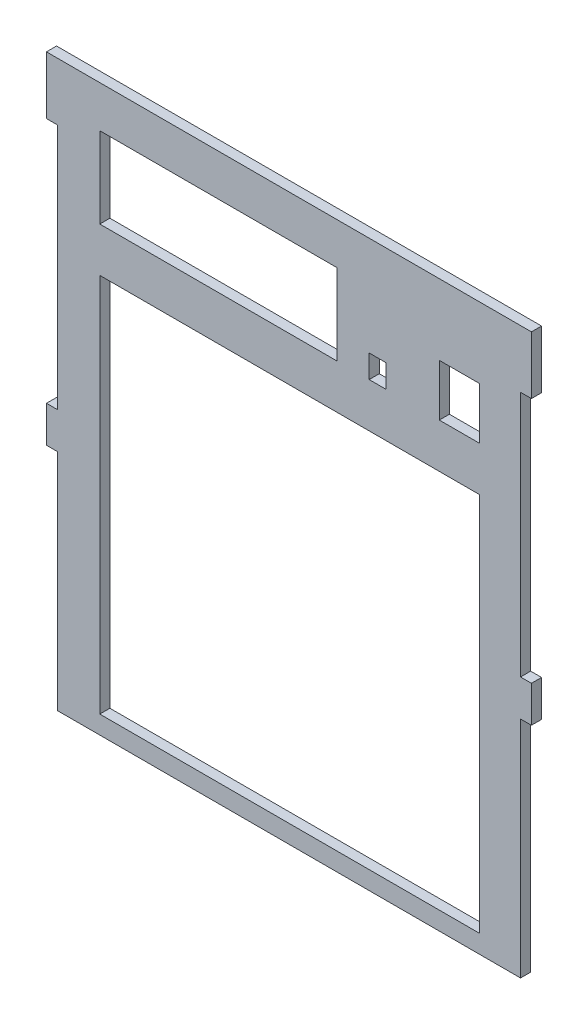
ISO-10303-21;
HEADER;
FILE_DESCRIPTION(('STEP AP214'),'2;1');
FILE_NAME('part.step','',(''),(''),'','','');
FILE_SCHEMA(('AUTOMOTIVE_DESIGN { 1 0 10303 214 1 1 1 1 }'));
ENDSEC;
DATA;
#1=APPLICATION_CONTEXT('core data for automotive mechanical design processes');
#2=APPLICATION_PROTOCOL_DEFINITION('international standard','automotive_design',2000,#1);
#3=PRODUCT_CONTEXT('',#1,'mechanical');
#4=PRODUCT('Part','Part','',(#3));
#5=PRODUCT_RELATED_PRODUCT_CATEGORY('part','',(#4));
#6=PRODUCT_DEFINITION_FORMATION('','',#4);
#7=PRODUCT_DEFINITION_CONTEXT('part definition',#1,'design');
#8=PRODUCT_DEFINITION('design','',#6,#7);
#9=PRODUCT_DEFINITION_SHAPE('','',#8);
#10=(LENGTH_UNIT() NAMED_UNIT(*) SI_UNIT(.MILLI.,.METRE.));
#11=(NAMED_UNIT(*) PLANE_ANGLE_UNIT() SI_UNIT($,.RADIAN.));
#12=(NAMED_UNIT(*) SI_UNIT($,.STERADIAN.) SOLID_ANGLE_UNIT());
#13=UNCERTAINTY_MEASURE_WITH_UNIT(LENGTH_MEASURE(1.E-05),#10,'distance_accuracy_value','');
#14=(GEOMETRIC_REPRESENTATION_CONTEXT(3) GLOBAL_UNCERTAINTY_ASSIGNED_CONTEXT((#13)) GLOBAL_UNIT_ASSIGNED_CONTEXT((#10,
#11,#12)) REPRESENTATION_CONTEXT('',''));
#15=CARTESIAN_POINT('',(0.,0.,0.));
#16=DIRECTION('',(0.,0.,1.));
#17=DIRECTION('',(1.,0.,0.));
#18=AXIS2_PLACEMENT_3D('',#15,#16,#17);
#19=CARTESIAN_POINT('',(3.42899999999999,223.139,0.));
#20=DIRECTION('',(1.,0.,0.));
#21=DIRECTION('',(0.,1.,0.));
#22=AXIS2_PLACEMENT_3D('',#19,#20,#21);
#23=PLANE('',#22);
#24=DIRECTION('',(0.,1.,0.));
#25=VECTOR('',#24,1.);
#26=CARTESIAN_POINT('',(3.42899999999999,223.139,0.));
#27=LINE('',#26,#25);
#28=CARTESIAN_POINT('',(3.42900000000001,145.669,0.));
#29=VERTEX_POINT('',#28);
#30=CARTESIAN_POINT('',(3.42899999999999,223.139,0.));
#31=VERTEX_POINT('',#30);
#32=EDGE_CURVE('E252',#29,#31,#27,.T.);
#33=ORIENTED_EDGE('',*,*,#32,.F.);
#34=DIRECTION('',(0.,0.,1.));
#35=VECTOR('',#34,1.);
#36=CARTESIAN_POINT('',(3.42900000000001,145.669,-11.9332703396849));
#37=LINE('',#36,#35);
#38=CARTESIAN_POINT('',(3.42900000000001,145.669,3.175));
#39=VERTEX_POINT('',#38);
#40=EDGE_CURVE('E262',#29,#39,#37,.T.);
#41=ORIENTED_EDGE('',*,*,#40,.T.);
#42=DIRECTION('',(0.,1.,0.));
#43=VECTOR('',#42,1.);
#44=CARTESIAN_POINT('',(3.42899999999999,223.139,3.175));
#45=LINE('',#44,#43);
#46=CARTESIAN_POINT('',(3.42899999999999,223.139,3.175));
#47=VERTEX_POINT('',#46);
#48=EDGE_CURVE('E497',#39,#47,#45,.T.);
#49=ORIENTED_EDGE('',*,*,#48,.T.);
#50=DIRECTION('',(0.,0.,1.));
#51=VECTOR('',#50,1.);
#52=CARTESIAN_POINT('',(3.42899999999999,223.139,0.));
#53=LINE('',#52,#51);
#54=EDGE_CURVE('E271',#31,#47,#53,.T.);
#55=ORIENTED_EDGE('',*,*,#54,.F.);
#56=EDGE_LOOP('',(#33,#41,#49,#55));
#57=FACE_BOUND('',#56,.T.);
#58=ADVANCED_FACE('F37',(#57),#23,.F.);
#59=CARTESIAN_POINT('',(148.971,223.139,0.));
#60=DIRECTION('',(-1.,0.,0.));
#61=DIRECTION('',(0.,-1.,0.));
#62=AXIS2_PLACEMENT_3D('',#59,#60,#61);
#63=PLANE('',#62);
#64=DIRECTION('',(0.,-1.,0.));
#65=VECTOR('',#64,1.);
#66=CARTESIAN_POINT('',(148.971,223.139,0.));
#67=LINE('',#66,#65);
#68=CARTESIAN_POINT('',(148.971,134.239,0.));
#69=VERTEX_POINT('',#68);
#70=CARTESIAN_POINT('',(148.971,63.754,0.));
#71=VERTEX_POINT('',#70);
#72=EDGE_CURVE('E284',#69,#71,#67,.T.);
#73=ORIENTED_EDGE('',*,*,#72,.F.);
#74=DIRECTION('',(0.,0.,1.));
#75=VECTOR('',#74,1.);
#76=CARTESIAN_POINT('',(148.971,134.239,-11.9332703396849));
#77=LINE('',#76,#75);
#78=CARTESIAN_POINT('',(148.971,134.239,3.175));
#79=VERTEX_POINT('',#78);
#80=EDGE_CURVE('E347',#69,#79,#77,.T.);
#81=ORIENTED_EDGE('',*,*,#80,.T.);
#82=DIRECTION('',(0.,-1.,0.));
#83=VECTOR('',#82,1.);
#84=CARTESIAN_POINT('',(148.971,223.139,3.175));
#85=LINE('',#84,#83);
#86=CARTESIAN_POINT('',(148.971,63.754,3.175));
#87=VERTEX_POINT('',#86);
#88=EDGE_CURVE('E293',#79,#87,#85,.T.);
#89=ORIENTED_EDGE('',*,*,#88,.T.);
#90=DIRECTION('',(0.,0.,-1.));
#91=VECTOR('',#90,1.);
#92=CARTESIAN_POINT('',(148.971,63.754,0.));
#93=LINE('',#92,#91);
#94=EDGE_CURVE('E363',#87,#71,#93,.T.);
#95=ORIENTED_EDGE('',*,*,#94,.T.);
#96=EDGE_LOOP('',(#73,#81,#89,#95));
#97=FACE_BOUND('',#96,.T.);
#98=ADVANCED_FACE('F514',(#97),#63,.F.);
#99=CARTESIAN_POINT('',(0.,0.,3.175));
#100=DIRECTION('',(1.,0.,0.));
#101=DIRECTION('',(0.,0.,-1.));
#102=AXIS2_PLACEMENT_3D('',#99,#100,#101);
#103=PLANE('',#102);
#104=DIRECTION('',(0.,-1.,0.));
#105=VECTOR('',#104,1.);
#106=CARTESIAN_POINT('',(0.,0.,0.));
#107=LINE('',#106,#105);
#108=CARTESIAN_POINT('',(0.,241.3,0.));
#109=VERTEX_POINT('',#108);
#110=CARTESIAN_POINT('',(0.,223.139,0.));
#111=VERTEX_POINT('',#110);
#112=EDGE_CURVE('E299',#109,#111,#107,.T.);
#113=ORIENTED_EDGE('',*,*,#112,.T.);
#114=DIRECTION('',(0.,0.,1.));
#115=VECTOR('',#114,1.);
#116=CARTESIAN_POINT('',(0.,223.139,0.));
#117=LINE('',#116,#115);
#118=CARTESIAN_POINT('',(0.,223.139,3.175));
#119=VERTEX_POINT('',#118);
#120=EDGE_CURVE('E330',#111,#119,#117,.T.);
#121=ORIENTED_EDGE('',*,*,#120,.T.);
#122=DIRECTION('',(0.,-1.,0.));
#123=VECTOR('',#122,1.);
#124=CARTESIAN_POINT('',(0.,0.,3.175));
#125=LINE('',#124,#123);
#126=CARTESIAN_POINT('',(0.,241.3,3.175));
#127=VERTEX_POINT('',#126);
#128=EDGE_CURVE('E301',#127,#119,#125,.T.);
#129=ORIENTED_EDGE('',*,*,#128,.F.);
#130=DIRECTION('',(0.,0.,-1.));
#131=VECTOR('',#130,1.);
#132=CARTESIAN_POINT('',(0.,241.3,3.175));
#133=LINE('',#132,#131);
#134=EDGE_CURVE('E309',#127,#109,#133,.T.);
#135=ORIENTED_EDGE('',*,*,#134,.T.);
#136=EDGE_LOOP('',(#113,#121,#129,#135));
#137=FACE_BOUND('',#136,.T.);
#138=ADVANCED_FACE('F39',(#137),#103,.F.);
#139=CARTESIAN_POINT('',(152.4,0.,3.175));
#140=DIRECTION('',(-1.,0.,0.));
#141=DIRECTION('',(0.,0.,1.));
#142=AXIS2_PLACEMENT_3D('',#139,#140,#141);
#143=PLANE('',#142);
#144=DIRECTION('',(0.,1.,0.));
#145=VECTOR('',#144,1.);
#146=CARTESIAN_POINT('',(152.4,0.,3.175));
#147=LINE('',#146,#145);
#148=CARTESIAN_POINT('',(152.4,223.139,3.175));
#149=VERTEX_POINT('',#148);
#150=CARTESIAN_POINT('',(152.4,241.3,3.175));
#151=VERTEX_POINT('',#150);
#152=EDGE_CURVE('E304',#149,#151,#147,.T.);
#153=ORIENTED_EDGE('',*,*,#152,.F.);
#154=DIRECTION('',(0.,0.,1.));
#155=VECTOR('',#154,1.);
#156=CARTESIAN_POINT('',(152.4,223.139,0.));
#157=LINE('',#156,#155);
#158=CARTESIAN_POINT('',(152.4,223.139,0.));
#159=VERTEX_POINT('',#158);
#160=EDGE_CURVE('E289',#159,#149,#157,.T.);
#161=ORIENTED_EDGE('',*,*,#160,.F.);
#162=DIRECTION('',(0.,1.,0.));
#163=VECTOR('',#162,1.);
#164=CARTESIAN_POINT('',(152.4,0.,0.));
#165=LINE('',#164,#163);
#166=CARTESIAN_POINT('',(152.4,241.3,0.));
#167=VERTEX_POINT('',#166);
#168=EDGE_CURVE('E312',#159,#167,#165,.T.);
#169=ORIENTED_EDGE('',*,*,#168,.T.);
#170=DIRECTION('',(0.,0.,-1.));
#171=VECTOR('',#170,1.);
#172=CARTESIAN_POINT('',(152.4,241.3,3.175));
#173=LINE('',#172,#171);
#174=EDGE_CURVE('E45',#151,#167,#173,.T.);
#175=ORIENTED_EDGE('',*,*,#174,.F.);
#176=EDGE_LOOP('',(#153,#161,#169,#175));
#177=FACE_BOUND('',#176,.T.);
#178=ADVANCED_FACE('F338',(#177),#143,.F.);
#179=CARTESIAN_POINT('',(0.,241.3,3.175));
#180=DIRECTION('',(0.,-1.,0.));
#181=DIRECTION('',(0.,0.,-1.));
#182=AXIS2_PLACEMENT_3D('',#179,#180,#181);
#183=PLANE('',#182);
#184=DIRECTION('',(-1.,0.,0.));
#185=VECTOR('',#184,1.);
#186=CARTESIAN_POINT('',(0.,241.3,0.));
#187=LINE('',#186,#185);
#188=EDGE_CURVE('E305',#167,#109,#187,.T.);
#189=ORIENTED_EDGE('',*,*,#188,.T.);
#190=ORIENTED_EDGE('',*,*,#134,.F.);
#191=DIRECTION('',(-1.,0.,0.));
#192=VECTOR('',#191,1.);
#193=CARTESIAN_POINT('',(0.,241.3,3.175));
#194=LINE('',#193,#192);
#195=EDGE_CURVE('E307',#151,#127,#194,.T.);
#196=ORIENTED_EDGE('',*,*,#195,.F.);
#197=ORIENTED_EDGE('',*,*,#174,.T.);
#198=EDGE_LOOP('',(#189,#190,#196,#197));
#199=FACE_BOUND('',#198,.T.);
#200=ADVANCED_FACE('F321',(#199),#183,.F.);
#201=CARTESIAN_POINT('',(0.,0.,3.175));
#202=DIRECTION('',(0.,0.,-1.));
#203=DIRECTION('',(-1.,0.,0.));
#204=AXIS2_PLACEMENT_3D('',#201,#202,#203);
#205=PLANE('',#204);
#206=DIRECTION('',(1.,0.,0.));
#207=VECTOR('',#206,1.);
#208=CARTESIAN_POINT('',(16.764,69.469,3.175));
#209=LINE('',#208,#207);
#210=CARTESIAN_POINT('',(16.764,69.469,3.175));
#211=VERTEX_POINT('',#210);
#212=CARTESIAN_POINT('',(136.144,69.469,3.175));
#213=VERTEX_POINT('',#212);
#214=EDGE_CURVE('E480',#211,#213,#209,.T.);
#215=ORIENTED_EDGE('',*,*,#214,.F.);
#216=DIRECTION('',(0.,-1.,0.));
#217=VECTOR('',#216,1.);
#218=CARTESIAN_POINT('',(16.764,188.849,3.175));
#219=LINE('',#218,#217);
#220=CARTESIAN_POINT('',(16.764,188.849,3.175));
#221=VERTEX_POINT('',#220);
#222=EDGE_CURVE('E483',#221,#211,#219,.T.);
#223=ORIENTED_EDGE('',*,*,#222,.F.);
#224=DIRECTION('',(-1.,0.,0.));
#225=VECTOR('',#224,1.);
#226=CARTESIAN_POINT('',(16.764,188.849,3.175));
#227=LINE('',#226,#225);
#228=CARTESIAN_POINT('',(136.144,188.849,3.175));
#229=VERTEX_POINT('',#228);
#230=EDGE_CURVE('E473',#229,#221,#227,.T.);
#231=ORIENTED_EDGE('',*,*,#230,.F.);
#232=DIRECTION('',(0.,1.,0.));
#233=VECTOR('',#232,1.);
#234=CARTESIAN_POINT('',(136.144,188.849,3.175));
#235=LINE('',#234,#233);
#236=EDGE_CURVE('E476',#213,#229,#235,.T.);
#237=ORIENTED_EDGE('',*,*,#236,.F.);
#238=EDGE_LOOP('',(#215,#223,#231,#237));
#239=FACE_BOUND('',#238,.T.);
#240=DIRECTION('',(1.,0.,0.));
#241=VECTOR('',#240,1.);
#242=CARTESIAN_POINT('',(16.764,202.819,3.175));
#243=LINE('',#242,#241);
#244=CARTESIAN_POINT('',(16.764,202.819,3.175));
#245=VERTEX_POINT('',#244);
#246=CARTESIAN_POINT('',(91.3765,202.819,3.175));
#247=VERTEX_POINT('',#246);
#248=EDGE_CURVE('E448',#245,#247,#243,.T.);
#249=ORIENTED_EDGE('',*,*,#248,.F.);
#250=DIRECTION('',(0.,-1.,0.));
#251=VECTOR('',#250,1.);
#252=CARTESIAN_POINT('',(16.764,228.219,3.175));
#253=LINE('',#252,#251);
#254=CARTESIAN_POINT('',(16.764,228.219,3.175));
#255=VERTEX_POINT('',#254);
#256=EDGE_CURVE('E451',#255,#245,#253,.T.);
#257=ORIENTED_EDGE('',*,*,#256,.F.);
#258=DIRECTION('',(-1.,0.,0.));
#259=VECTOR('',#258,1.);
#260=CARTESIAN_POINT('',(16.764,228.219,3.175));
#261=LINE('',#260,#259);
#262=CARTESIAN_POINT('',(91.3765,228.219,3.175));
#263=VERTEX_POINT('',#262);
#264=EDGE_CURVE('E441',#263,#255,#261,.T.);
#265=ORIENTED_EDGE('',*,*,#264,.F.);
#266=DIRECTION('',(0.,1.,0.));
#267=VECTOR('',#266,1.);
#268=CARTESIAN_POINT('',(91.3765,228.219,3.175));
#269=LINE('',#268,#267);
#270=EDGE_CURVE('E444',#247,#263,#269,.T.);
#271=ORIENTED_EDGE('',*,*,#270,.F.);
#272=EDGE_LOOP('',(#249,#257,#265,#271));
#273=FACE_BOUND('',#272,.T.);
#274=DIRECTION('',(1.,0.,0.));
#275=VECTOR('',#274,1.);
#276=CARTESIAN_POINT('',(123.444,202.819,3.175));
#277=LINE('',#276,#275);
#278=CARTESIAN_POINT('',(123.444,202.819,3.175));
#279=VERTEX_POINT('',#278);
#280=CARTESIAN_POINT('',(136.144,202.819,3.175));
#281=VERTEX_POINT('',#280);
#282=EDGE_CURVE('E416',#279,#281,#277,.T.);
#283=ORIENTED_EDGE('',*,*,#282,.F.);
#284=DIRECTION('',(0.,-1.,0.));
#285=VECTOR('',#284,1.);
#286=CARTESIAN_POINT('',(123.444,219.075,3.175));
#287=LINE('',#286,#285);
#288=CARTESIAN_POINT('',(123.444,219.075,3.175));
#289=VERTEX_POINT('',#288);
#290=EDGE_CURVE('E419',#289,#279,#287,.T.);
#291=ORIENTED_EDGE('',*,*,#290,.F.);
#292=DIRECTION('',(-1.,0.,0.));
#293=VECTOR('',#292,1.);
#294=CARTESIAN_POINT('',(123.444,219.075,3.175));
#295=LINE('',#294,#293);
#296=CARTESIAN_POINT('',(136.144,219.075,3.175));
#297=VERTEX_POINT('',#296);
#298=EDGE_CURVE('E409',#297,#289,#295,.T.);
#299=ORIENTED_EDGE('',*,*,#298,.F.);
#300=DIRECTION('',(0.,1.,0.));
#301=VECTOR('',#300,1.);
#302=CARTESIAN_POINT('',(136.144,219.075,3.175));
#303=LINE('',#302,#301);
#304=EDGE_CURVE('E412',#281,#297,#303,.T.);
#305=ORIENTED_EDGE('',*,*,#304,.F.);
#306=EDGE_LOOP('',(#283,#291,#299,#305));
#307=FACE_BOUND('',#306,.T.);
#308=DIRECTION('',(1.,0.,0.));
#309=VECTOR('',#308,1.);
#310=CARTESIAN_POINT('',(101.4095,202.819,3.175));
#311=LINE('',#310,#309);
#312=CARTESIAN_POINT('',(101.4095,202.819,3.175));
#313=VERTEX_POINT('',#312);
#314=CARTESIAN_POINT('',(106.7435,202.819,3.175));
#315=VERTEX_POINT('',#314);
#316=EDGE_CURVE('E384',#313,#315,#311,.T.);
#317=ORIENTED_EDGE('',*,*,#316,.F.);
#318=DIRECTION('',(0.,-1.,0.));
#319=VECTOR('',#318,1.);
#320=CARTESIAN_POINT('',(101.4095,210.058,3.175));
#321=LINE('',#320,#319);
#322=CARTESIAN_POINT('',(101.4095,210.058,3.175));
#323=VERTEX_POINT('',#322);
#324=EDGE_CURVE('E387',#323,#313,#321,.T.);
#325=ORIENTED_EDGE('',*,*,#324,.F.);
#326=DIRECTION('',(-1.,0.,0.));
#327=VECTOR('',#326,1.);
#328=CARTESIAN_POINT('',(101.4095,210.058,3.175));
#329=LINE('',#328,#327);
#330=CARTESIAN_POINT('',(106.7435,210.058,3.175));
#331=VERTEX_POINT('',#330);
#332=EDGE_CURVE('E377',#331,#323,#329,.T.);
#333=ORIENTED_EDGE('',*,*,#332,.F.);
#334=DIRECTION('',(0.,1.,0.));
#335=VECTOR('',#334,1.);
#336=CARTESIAN_POINT('',(106.7435,210.058,3.175));
#337=LINE('',#336,#335);
#338=EDGE_CURVE('E380',#315,#331,#337,.T.);
#339=ORIENTED_EDGE('',*,*,#338,.F.);
#340=EDGE_LOOP('',(#317,#325,#333,#339));
#341=FACE_BOUND('',#340,.T.);
#342=CARTESIAN_POINT('',(3.42900000000001,63.7540000000001,3.175));
#343=VERTEX_POINT('',#342);
#344=CARTESIAN_POINT('',(3.42900000000001,134.239,3.175));
#345=VERTEX_POINT('',#344);
#346=EDGE_CURVE('E294',#343,#345,#45,.T.);
#347=ORIENTED_EDGE('',*,*,#346,.F.);
#348=DIRECTION('',(-1.,0.,0.));
#349=VECTOR('',#348,1.);
#350=CARTESIAN_POINT('',(169.390878768756,63.754,3.175));
#351=LINE('',#350,#349);
#352=EDGE_CURVE('E350',#87,#343,#351,.T.);
#353=ORIENTED_EDGE('',*,*,#352,.F.);
#354=ORIENTED_EDGE('',*,*,#88,.F.);
#355=DIRECTION('',(1.,0.,0.));
#356=VECTOR('',#355,1.);
#357=CARTESIAN_POINT('',(148.971,134.239,3.175));
#358=LINE('',#357,#356);
#359=CARTESIAN_POINT('',(152.4,134.239,3.175));
#360=VERTEX_POINT('',#359);
#361=EDGE_CURVE('E945',#79,#360,#358,.T.);
#362=ORIENTED_EDGE('',*,*,#361,.T.);
#363=DIRECTION('',(0.,1.,0.));
#364=VECTOR('',#363,1.);
#365=CARTESIAN_POINT('',(152.4,145.669,3.175));
#366=LINE('',#365,#364);
#367=CARTESIAN_POINT('',(152.4,145.669,3.175));
#368=VERTEX_POINT('',#367);
#369=EDGE_CURVE('E951',#360,#368,#366,.T.);
#370=ORIENTED_EDGE('',*,*,#369,.T.);
#371=DIRECTION('',(-1.,0.,0.));
#372=VECTOR('',#371,1.);
#373=CARTESIAN_POINT('',(148.971,145.669,3.175));
#374=LINE('',#373,#372);
#375=CARTESIAN_POINT('',(148.971,145.669,3.175));
#376=VERTEX_POINT('',#375);
#377=EDGE_CURVE('E949',#368,#376,#374,.T.);
#378=ORIENTED_EDGE('',*,*,#377,.T.);
#379=CARTESIAN_POINT('',(148.971,223.139,3.175));
#380=VERTEX_POINT('',#379);
#381=EDGE_CURVE('E285',#380,#376,#85,.T.);
#382=ORIENTED_EDGE('',*,*,#381,.F.);
#383=DIRECTION('',(-1.,0.,0.));
#384=VECTOR('',#383,1.);
#385=CARTESIAN_POINT('',(152.4,223.139,3.175));
#386=LINE('',#385,#384);
#387=EDGE_CURVE('E290',#149,#380,#386,.T.);
#388=ORIENTED_EDGE('',*,*,#387,.F.);
#389=ORIENTED_EDGE('',*,*,#152,.T.);
#390=ORIENTED_EDGE('',*,*,#195,.T.);
#391=ORIENTED_EDGE('',*,*,#128,.T.);
#392=DIRECTION('',(-1.,0.,0.));
#393=VECTOR('',#392,1.);
#394=CARTESIAN_POINT('',(0.,223.139,3.175));
#395=LINE('',#394,#393);
#396=EDGE_CURVE('E277',#47,#119,#395,.T.);
#397=ORIENTED_EDGE('',*,*,#396,.F.);
#398=ORIENTED_EDGE('',*,*,#48,.F.);
#399=DIRECTION('',(-1.,0.,0.));
#400=VECTOR('',#399,1.);
#401=CARTESIAN_POINT('',(3.42900000000001,145.669,3.175));
#402=LINE('',#401,#400);
#403=CARTESIAN_POINT('',(0.,145.669,3.175));
#404=VERTEX_POINT('',#403);
#405=EDGE_CURVE('E265',#39,#404,#402,.T.);
#406=ORIENTED_EDGE('',*,*,#405,.T.);
#407=DIRECTION('',(0.,-1.,0.));
#408=VECTOR('',#407,1.);
#409=CARTESIAN_POINT('',(0.,145.669,3.175));
#410=LINE('',#409,#408);
#411=CARTESIAN_POINT('',(0.,134.239,3.175));
#412=VERTEX_POINT('',#411);
#413=EDGE_CURVE('E936',#404,#412,#410,.T.);
#414=ORIENTED_EDGE('',*,*,#413,.T.);
#415=DIRECTION('',(1.,0.,0.));
#416=VECTOR('',#415,1.);
#417=CARTESIAN_POINT('',(3.42900000000001,134.239,3.175));
#418=LINE('',#417,#416);
#419=EDGE_CURVE('E258',#412,#345,#418,.T.);
#420=ORIENTED_EDGE('',*,*,#419,.T.);
#421=EDGE_LOOP('',(#347,#353,#354,#362,#370,#378,#382,#388,#389,#390,#391,#397,#398,#406,#414,#420));
#422=FACE_BOUND('',#421,.T.);
#423=ADVANCED_FACE('F334',(#239,#273,#307,#341,#422),#205,.F.);
#424=CARTESIAN_POINT('',(0.,0.,0.));
#425=DIRECTION('',(0.,0.,-1.));
#426=DIRECTION('',(-1.,0.,0.));
#427=AXIS2_PLACEMENT_3D('',#424,#425,#426);
#428=PLANE('',#427);
#429=DIRECTION('',(-1.,0.,0.));
#430=VECTOR('',#429,1.);
#431=CARTESIAN_POINT('',(169.390878768756,63.754,0.));
#432=LINE('',#431,#430);
#433=CARTESIAN_POINT('',(3.42900000000002,63.754,0.));
#434=VERTEX_POINT('',#433);
#435=EDGE_CURVE('E361',#71,#434,#432,.T.);
#436=ORIENTED_EDGE('',*,*,#435,.T.);
#437=CARTESIAN_POINT('',(3.429,134.239,0.));
#438=VERTEX_POINT('',#437);
#439=EDGE_CURVE('E273',#434,#438,#27,.T.);
#440=ORIENTED_EDGE('',*,*,#439,.T.);
#441=DIRECTION('',(1.,0.,0.));
#442=VECTOR('',#441,1.);
#443=CARTESIAN_POINT('',(3.42900000000001,134.239,0.));
#444=LINE('',#443,#442);
#445=CARTESIAN_POINT('',(0.,134.239,0.));
#446=VERTEX_POINT('',#445);
#447=EDGE_CURVE('E52',#446,#438,#444,.T.);
#448=ORIENTED_EDGE('',*,*,#447,.F.);
#449=DIRECTION('',(0.,-1.,0.));
#450=VECTOR('',#449,1.);
#451=CARTESIAN_POINT('',(0.,145.669,0.));
#452=LINE('',#451,#450);
#453=CARTESIAN_POINT('',(0.,145.669,0.));
#454=VERTEX_POINT('',#453);
#455=EDGE_CURVE('E255',#454,#446,#452,.T.);
#456=ORIENTED_EDGE('',*,*,#455,.F.);
#457=DIRECTION('',(-1.,0.,0.));
#458=VECTOR('',#457,1.);
#459=CARTESIAN_POINT('',(3.42900000000001,145.669,0.));
#460=LINE('',#459,#458);
#461=EDGE_CURVE('E245',#29,#454,#460,.T.);
#462=ORIENTED_EDGE('',*,*,#461,.F.);
#463=ORIENTED_EDGE('',*,*,#32,.T.);
#464=DIRECTION('',(-1.,0.,0.));
#465=VECTOR('',#464,1.);
#466=CARTESIAN_POINT('',(0.,223.139,0.));
#467=LINE('',#466,#465);
#468=EDGE_CURVE('E274',#31,#111,#467,.T.);
#469=ORIENTED_EDGE('',*,*,#468,.T.);
#470=ORIENTED_EDGE('',*,*,#112,.F.);
#471=ORIENTED_EDGE('',*,*,#188,.F.);
#472=ORIENTED_EDGE('',*,*,#168,.F.);
#473=DIRECTION('',(-1.,0.,0.));
#474=VECTOR('',#473,1.);
#475=CARTESIAN_POINT('',(152.4,223.139,0.));
#476=LINE('',#475,#474);
#477=CARTESIAN_POINT('',(148.971,223.139,0.));
#478=VERTEX_POINT('',#477);
#479=EDGE_CURVE('E281',#159,#478,#476,.T.);
#480=ORIENTED_EDGE('',*,*,#479,.T.);
#481=CARTESIAN_POINT('',(148.971,145.669,0.));
#482=VERTEX_POINT('',#481);
#483=EDGE_CURVE('E286',#478,#482,#67,.T.);
#484=ORIENTED_EDGE('',*,*,#483,.T.);
#485=DIRECTION('',(-1.,0.,0.));
#486=VECTOR('',#485,1.);
#487=CARTESIAN_POINT('',(148.971,145.669,0.));
#488=LINE('',#487,#486);
#489=CARTESIAN_POINT('',(152.4,145.669,0.));
#490=VERTEX_POINT('',#489);
#491=EDGE_CURVE('E60',#490,#482,#488,.T.);
#492=ORIENTED_EDGE('',*,*,#491,.F.);
#493=DIRECTION('',(0.,1.,0.));
#494=VECTOR('',#493,1.);
#495=CARTESIAN_POINT('',(152.4,145.669,0.));
#496=LINE('',#495,#494);
#497=CARTESIAN_POINT('',(152.4,134.239,0.));
#498=VERTEX_POINT('',#497);
#499=EDGE_CURVE('E356',#498,#490,#496,.T.);
#500=ORIENTED_EDGE('',*,*,#499,.F.);
#501=DIRECTION('',(1.,0.,0.));
#502=VECTOR('',#501,1.);
#503=CARTESIAN_POINT('',(148.971,134.239,0.));
#504=LINE('',#503,#502);
#505=EDGE_CURVE('E359',#69,#498,#504,.T.);
#506=ORIENTED_EDGE('',*,*,#505,.F.);
#507=ORIENTED_EDGE('',*,*,#72,.T.);
#508=EDGE_LOOP('',(#436,#440,#448,#456,#462,#463,#469,#470,#471,#472,#480,#484,#492,#500,#506,#507));
#509=FACE_BOUND('',#508,.T.);
#510=DIRECTION('',(0.,-1.,0.));
#511=VECTOR('',#510,1.);
#512=CARTESIAN_POINT('',(16.764,188.849,0.));
#513=LINE('',#512,#511);
#514=CARTESIAN_POINT('',(16.764,188.849,0.));
#515=VERTEX_POINT('',#514);
#516=CARTESIAN_POINT('',(16.764,69.469,0.));
#517=VERTEX_POINT('',#516);
#518=EDGE_CURVE('E477',#515,#517,#513,.T.);
#519=ORIENTED_EDGE('',*,*,#518,.T.);
#520=DIRECTION('',(1.,0.,0.));
#521=VECTOR('',#520,1.);
#522=CARTESIAN_POINT('',(16.764,69.469,0.));
#523=LINE('',#522,#521);
#524=CARTESIAN_POINT('',(136.144,69.469,0.));
#525=VERTEX_POINT('',#524);
#526=EDGE_CURVE('E490',#517,#525,#523,.T.);
#527=ORIENTED_EDGE('',*,*,#526,.T.);
#528=DIRECTION('',(0.,1.,0.));
#529=VECTOR('',#528,1.);
#530=CARTESIAN_POINT('',(136.144,188.849,0.));
#531=LINE('',#530,#529);
#532=CARTESIAN_POINT('',(136.144,188.849,0.));
#533=VERTEX_POINT('',#532);
#534=EDGE_CURVE('E487',#525,#533,#531,.T.);
#535=ORIENTED_EDGE('',*,*,#534,.T.);
#536=DIRECTION('',(-1.,0.,0.));
#537=VECTOR('',#536,1.);
#538=CARTESIAN_POINT('',(16.764,188.849,0.));
#539=LINE('',#538,#537);
#540=EDGE_CURVE('E467',#533,#515,#539,.T.);
#541=ORIENTED_EDGE('',*,*,#540,.T.);
#542=EDGE_LOOP('',(#519,#527,#535,#541));
#543=FACE_BOUND('',#542,.T.);
#544=DIRECTION('',(0.,-1.,0.));
#545=VECTOR('',#544,1.);
#546=CARTESIAN_POINT('',(16.764,228.219,0.));
#547=LINE('',#546,#545);
#548=CARTESIAN_POINT('',(16.764,228.219,0.));
#549=VERTEX_POINT('',#548);
#550=CARTESIAN_POINT('',(16.764,202.819,0.));
#551=VERTEX_POINT('',#550);
#552=EDGE_CURVE('E445',#549,#551,#547,.T.);
#553=ORIENTED_EDGE('',*,*,#552,.T.);
#554=DIRECTION('',(1.,0.,0.));
#555=VECTOR('',#554,1.);
#556=CARTESIAN_POINT('',(16.764,202.819,0.));
#557=LINE('',#556,#555);
#558=CARTESIAN_POINT('',(91.3765,202.819,0.));
#559=VERTEX_POINT('',#558);
#560=EDGE_CURVE('E459',#551,#559,#557,.T.);
#561=ORIENTED_EDGE('',*,*,#560,.T.);
#562=DIRECTION('',(0.,1.,0.));
#563=VECTOR('',#562,1.);
#564=CARTESIAN_POINT('',(91.3765,228.219,0.));
#565=LINE('',#564,#563);
#566=CARTESIAN_POINT('',(91.3765,228.219,0.));
#567=VERTEX_POINT('',#566);
#568=EDGE_CURVE('E456',#559,#567,#565,.T.);
#569=ORIENTED_EDGE('',*,*,#568,.T.);
#570=DIRECTION('',(-1.,0.,0.));
#571=VECTOR('',#570,1.);
#572=CARTESIAN_POINT('',(16.764,228.219,0.));
#573=LINE('',#572,#571);
#574=EDGE_CURVE('E435',#567,#549,#573,.T.);
#575=ORIENTED_EDGE('',*,*,#574,.T.);
#576=EDGE_LOOP('',(#553,#561,#569,#575));
#577=FACE_BOUND('',#576,.T.);
#578=DIRECTION('',(0.,-1.,0.));
#579=VECTOR('',#578,1.);
#580=CARTESIAN_POINT('',(123.444,219.075,0.));
#581=LINE('',#580,#579);
#582=CARTESIAN_POINT('',(123.444,219.075,0.));
#583=VERTEX_POINT('',#582);
#584=CARTESIAN_POINT('',(123.444,202.819,0.));
#585=VERTEX_POINT('',#584);
#586=EDGE_CURVE('E413',#583,#585,#581,.T.);
#587=ORIENTED_EDGE('',*,*,#586,.T.);
#588=DIRECTION('',(1.,0.,0.));
#589=VECTOR('',#588,1.);
#590=CARTESIAN_POINT('',(123.444,202.819,0.));
#591=LINE('',#590,#589);
#592=CARTESIAN_POINT('',(136.144,202.819,0.));
#593=VERTEX_POINT('',#592);
#594=EDGE_CURVE('E427',#585,#593,#591,.T.);
#595=ORIENTED_EDGE('',*,*,#594,.T.);
#596=DIRECTION('',(0.,1.,0.));
#597=VECTOR('',#596,1.);
#598=CARTESIAN_POINT('',(136.144,219.075,0.));
#599=LINE('',#598,#597);
#600=CARTESIAN_POINT('',(136.144,219.075,0.));
#601=VERTEX_POINT('',#600);
#602=EDGE_CURVE('E424',#593,#601,#599,.T.);
#603=ORIENTED_EDGE('',*,*,#602,.T.);
#604=DIRECTION('',(-1.,0.,0.));
#605=VECTOR('',#604,1.);
#606=CARTESIAN_POINT('',(123.444,219.075,0.));
#607=LINE('',#606,#605);
#608=EDGE_CURVE('E403',#601,#583,#607,.T.);
#609=ORIENTED_EDGE('',*,*,#608,.T.);
#610=EDGE_LOOP('',(#587,#595,#603,#609));
#611=FACE_BOUND('',#610,.T.);
#612=DIRECTION('',(0.,-1.,0.));
#613=VECTOR('',#612,1.);
#614=CARTESIAN_POINT('',(101.4095,210.058,0.));
#615=LINE('',#614,#613);
#616=CARTESIAN_POINT('',(101.4095,210.058,0.));
#617=VERTEX_POINT('',#616);
#618=CARTESIAN_POINT('',(101.4095,202.819,0.));
#619=VERTEX_POINT('',#618);
#620=EDGE_CURVE('E381',#617,#619,#615,.T.);
#621=ORIENTED_EDGE('',*,*,#620,.T.);
#622=DIRECTION('',(1.,0.,0.));
#623=VECTOR('',#622,1.);
#624=CARTESIAN_POINT('',(101.4095,202.819,0.));
#625=LINE('',#624,#623);
#626=CARTESIAN_POINT('',(106.7435,202.819,0.));
#627=VERTEX_POINT('',#626);
#628=EDGE_CURVE('E395',#619,#627,#625,.T.);
#629=ORIENTED_EDGE('',*,*,#628,.T.);
#630=DIRECTION('',(0.,1.,0.));
#631=VECTOR('',#630,1.);
#632=CARTESIAN_POINT('',(106.7435,210.058,0.));
#633=LINE('',#632,#631);
#634=CARTESIAN_POINT('',(106.7435,210.058,0.));
#635=VERTEX_POINT('',#634);
#636=EDGE_CURVE('E392',#627,#635,#633,.T.);
#637=ORIENTED_EDGE('',*,*,#636,.T.);
#638=DIRECTION('',(-1.,0.,0.));
#639=VECTOR('',#638,1.);
#640=CARTESIAN_POINT('',(101.4095,210.058,0.));
#641=LINE('',#640,#639);
#642=EDGE_CURVE('E371',#635,#617,#641,.T.);
#643=ORIENTED_EDGE('',*,*,#642,.T.);
#644=EDGE_LOOP('',(#621,#629,#637,#643));
#645=FACE_BOUND('',#644,.T.);
#646=ADVANCED_FACE('F248',(#509,#543,#577,#611,#645),#428,.T.);
#647=ORIENTED_EDGE('',*,*,#381,.T.);
#648=DIRECTION('',(0.,0.,1.));
#649=VECTOR('',#648,1.);
#650=CARTESIAN_POINT('',(148.971,145.669,-11.9332703396849));
#651=LINE('',#650,#649);
#652=EDGE_CURVE('E344',#482,#376,#651,.T.);
#653=ORIENTED_EDGE('',*,*,#652,.F.);
#654=ORIENTED_EDGE('',*,*,#483,.F.);
#655=DIRECTION('',(0.,0.,1.));
#656=VECTOR('',#655,1.);
#657=CARTESIAN_POINT('',(148.971,223.139,0.));
#658=LINE('',#657,#656);
#659=EDGE_CURVE('E297',#478,#380,#658,.T.);
#660=ORIENTED_EDGE('',*,*,#659,.T.);
#661=EDGE_LOOP('',(#647,#653,#654,#660));
#662=FACE_BOUND('',#661,.T.);
#663=ADVANCED_FACE('F343',(#662),#63,.F.);
#664=CARTESIAN_POINT('',(152.4,223.139,0.));
#665=DIRECTION('',(0.,1.,0.));
#666=DIRECTION('',(0.,0.,1.));
#667=AXIS2_PLACEMENT_3D('',#664,#665,#666);
#668=PLANE('',#667);
#669=ORIENTED_EDGE('',*,*,#387,.T.);
#670=ORIENTED_EDGE('',*,*,#659,.F.);
#671=ORIENTED_EDGE('',*,*,#479,.F.);
#672=ORIENTED_EDGE('',*,*,#160,.T.);
#673=EDGE_LOOP('',(#669,#670,#671,#672));
#674=FACE_BOUND('',#673,.T.);
#675=ADVANCED_FACE('F340',(#674),#668,.F.);
#676=CARTESIAN_POINT('',(0.,223.139,0.));
#677=DIRECTION('',(0.,1.,0.));
#678=DIRECTION('',(0.,0.,1.));
#679=AXIS2_PLACEMENT_3D('',#676,#677,#678);
#680=PLANE('',#679);
#681=ORIENTED_EDGE('',*,*,#396,.T.);
#682=ORIENTED_EDGE('',*,*,#120,.F.);
#683=ORIENTED_EDGE('',*,*,#468,.F.);
#684=ORIENTED_EDGE('',*,*,#54,.T.);
#685=EDGE_LOOP('',(#681,#682,#683,#684));
#686=FACE_BOUND('',#685,.T.);
#687=ADVANCED_FACE('F501',(#686),#680,.F.);
#688=ORIENTED_EDGE('',*,*,#346,.T.);
#689=DIRECTION('',(0.,0.,1.));
#690=VECTOR('',#689,1.);
#691=CARTESIAN_POINT('',(3.42900000000001,134.239,-11.9332703396849));
#692=LINE('',#691,#690);
#693=EDGE_CURVE('E268',#438,#345,#692,.T.);
#694=ORIENTED_EDGE('',*,*,#693,.F.);
#695=ORIENTED_EDGE('',*,*,#439,.F.);
#696=DIRECTION('',(0.,0.,1.));
#697=VECTOR('',#696,1.);
#698=CARTESIAN_POINT('',(3.42900000000001,63.7539999999999,0.));
#699=LINE('',#698,#697);
#700=EDGE_CURVE('E11',#434,#343,#699,.T.);
#701=ORIENTED_EDGE('',*,*,#700,.T.);
#702=EDGE_LOOP('',(#688,#694,#695,#701));
#703=FACE_BOUND('',#702,.T.);
#704=ADVANCED_FACE('F503',(#703),#23,.F.);
#705=CARTESIAN_POINT('',(101.4095,210.058,0.));
#706=DIRECTION('',(-1.,0.,0.));
#707=DIRECTION('',(0.,-1.,0.));
#708=AXIS2_PLACEMENT_3D('',#705,#706,#707);
#709=PLANE('',#708);
#710=ORIENTED_EDGE('',*,*,#324,.T.);
#711=DIRECTION('',(0.,0.,1.));
#712=VECTOR('',#711,1.);
#713=CARTESIAN_POINT('',(101.4095,202.819,0.));
#714=LINE('',#713,#712);
#715=EDGE_CURVE('E368',#619,#313,#714,.T.);
#716=ORIENTED_EDGE('',*,*,#715,.F.);
#717=ORIENTED_EDGE('',*,*,#620,.F.);
#718=DIRECTION('',(0.,0.,1.));
#719=VECTOR('',#718,1.);
#720=CARTESIAN_POINT('',(101.4095,210.058,0.));
#721=LINE('',#720,#719);
#722=EDGE_CURVE('E367',#617,#323,#721,.T.);
#723=ORIENTED_EDGE('',*,*,#722,.T.);
#724=EDGE_LOOP('',(#710,#716,#717,#723));
#725=FACE_BOUND('',#724,.T.);
#726=ADVANCED_FACE('F509',(#725),#709,.F.);
#727=CARTESIAN_POINT('',(101.4095,210.058,0.));
#728=DIRECTION('',(0.,1.,0.));
#729=DIRECTION('',(-1.,0.,0.));
#730=AXIS2_PLACEMENT_3D('',#727,#728,#729);
#731=PLANE('',#730);
#732=ORIENTED_EDGE('',*,*,#332,.T.);
#733=ORIENTED_EDGE('',*,*,#722,.F.);
#734=ORIENTED_EDGE('',*,*,#642,.F.);
#735=DIRECTION('',(0.,0.,1.));
#736=VECTOR('',#735,1.);
#737=CARTESIAN_POINT('',(106.7435,210.058,0.));
#738=LINE('',#737,#736);
#739=EDGE_CURVE('E374',#635,#331,#738,.T.);
#740=ORIENTED_EDGE('',*,*,#739,.T.);
#741=EDGE_LOOP('',(#732,#733,#734,#740));
#742=FACE_BOUND('',#741,.T.);
#743=ADVANCED_FACE('F570',(#742),#731,.F.);
#744=CARTESIAN_POINT('',(106.7435,210.058,0.));
#745=DIRECTION('',(1.,0.,0.));
#746=DIRECTION('',(0.,0.,-1.));
#747=AXIS2_PLACEMENT_3D('',#744,#745,#746);
#748=PLANE('',#747);
#749=ORIENTED_EDGE('',*,*,#338,.T.);
#750=ORIENTED_EDGE('',*,*,#739,.F.);
#751=ORIENTED_EDGE('',*,*,#636,.F.);
#752=DIRECTION('',(0.,0.,1.));
#753=VECTOR('',#752,1.);
#754=CARTESIAN_POINT('',(106.7435,202.819,0.));
#755=LINE('',#754,#753);
#756=EDGE_CURVE('E372',#627,#315,#755,.T.);
#757=ORIENTED_EDGE('',*,*,#756,.T.);
#758=EDGE_LOOP('',(#749,#750,#751,#757));
#759=FACE_BOUND('',#758,.T.);
#760=ADVANCED_FACE('F573',(#759),#748,.F.);
#761=CARTESIAN_POINT('',(101.4095,202.819,0.));
#762=DIRECTION('',(0.,-1.,0.));
#763=DIRECTION('',(0.,0.,-1.));
#764=AXIS2_PLACEMENT_3D('',#761,#762,#763);
#765=PLANE('',#764);
#766=ORIENTED_EDGE('',*,*,#316,.T.);
#767=ORIENTED_EDGE('',*,*,#756,.F.);
#768=ORIENTED_EDGE('',*,*,#628,.F.);
#769=ORIENTED_EDGE('',*,*,#715,.T.);
#770=EDGE_LOOP('',(#766,#767,#768,#769));
#771=FACE_BOUND('',#770,.T.);
#772=ADVANCED_FACE('F568',(#771),#765,.F.);
#773=CARTESIAN_POINT('',(123.444,219.075,0.));
#774=DIRECTION('',(-1.,0.,0.));
#775=DIRECTION('',(0.,-1.,0.));
#776=AXIS2_PLACEMENT_3D('',#773,#774,#775);
#777=PLANE('',#776);
#778=ORIENTED_EDGE('',*,*,#290,.T.);
#779=DIRECTION('',(0.,0.,1.));
#780=VECTOR('',#779,1.);
#781=CARTESIAN_POINT('',(123.444,202.819,0.));
#782=LINE('',#781,#780);
#783=EDGE_CURVE('E400',#585,#279,#782,.T.);
#784=ORIENTED_EDGE('',*,*,#783,.F.);
#785=ORIENTED_EDGE('',*,*,#586,.F.);
#786=DIRECTION('',(0.,0.,1.));
#787=VECTOR('',#786,1.);
#788=CARTESIAN_POINT('',(123.444,219.075,0.));
#789=LINE('',#788,#787);
#790=EDGE_CURVE('E389',#583,#289,#789,.T.);
#791=ORIENTED_EDGE('',*,*,#790,.T.);
#792=EDGE_LOOP('',(#778,#784,#785,#791));
#793=FACE_BOUND('',#792,.T.);
#794=ADVANCED_FACE('F558',(#793),#777,.F.);
#795=CARTESIAN_POINT('',(123.444,219.075,0.));
#796=DIRECTION('',(0.,1.,0.));
#797=DIRECTION('',(-1.,0.,0.));
#798=AXIS2_PLACEMENT_3D('',#795,#796,#797);
#799=PLANE('',#798);
#800=ORIENTED_EDGE('',*,*,#298,.T.);
#801=ORIENTED_EDGE('',*,*,#790,.F.);
#802=ORIENTED_EDGE('',*,*,#608,.F.);
#803=DIRECTION('',(0.,0.,1.));
#804=VECTOR('',#803,1.);
#805=CARTESIAN_POINT('',(136.144,219.075,0.));
#806=LINE('',#805,#804);
#807=EDGE_CURVE('E406',#601,#297,#806,.T.);
#808=ORIENTED_EDGE('',*,*,#807,.T.);
#809=EDGE_LOOP('',(#800,#801,#802,#808));
#810=FACE_BOUND('',#809,.T.);
#811=ADVANCED_FACE('F554',(#810),#799,.F.);
#812=CARTESIAN_POINT('',(136.144,219.075,0.));
#813=DIRECTION('',(1.,0.,0.));
#814=DIRECTION('',(0.,1.,0.));
#815=AXIS2_PLACEMENT_3D('',#812,#813,#814);
#816=PLANE('',#815);
#817=ORIENTED_EDGE('',*,*,#304,.T.);
#818=ORIENTED_EDGE('',*,*,#807,.F.);
#819=ORIENTED_EDGE('',*,*,#602,.F.);
#820=DIRECTION('',(0.,0.,1.));
#821=VECTOR('',#820,1.);
#822=CARTESIAN_POINT('',(136.144,202.819,0.));
#823=LINE('',#822,#821);
#824=EDGE_CURVE('E404',#593,#281,#823,.T.);
#825=ORIENTED_EDGE('',*,*,#824,.T.);
#826=EDGE_LOOP('',(#817,#818,#819,#825));
#827=FACE_BOUND('',#826,.T.);
#828=ADVANCED_FACE('F557',(#827),#816,.F.);
#829=CARTESIAN_POINT('',(123.444,202.819,0.));
#830=DIRECTION('',(0.,-1.,0.));
#831=DIRECTION('',(0.,0.,-1.));
#832=AXIS2_PLACEMENT_3D('',#829,#830,#831);
#833=PLANE('',#832);
#834=ORIENTED_EDGE('',*,*,#282,.T.);
#835=ORIENTED_EDGE('',*,*,#824,.F.);
#836=ORIENTED_EDGE('',*,*,#594,.F.);
#837=ORIENTED_EDGE('',*,*,#783,.T.);
#838=EDGE_LOOP('',(#834,#835,#836,#837));
#839=FACE_BOUND('',#838,.T.);
#840=ADVANCED_FACE('F552',(#839),#833,.F.);
#841=CARTESIAN_POINT('',(16.764,228.219,0.));
#842=DIRECTION('',(-1.,0.,0.));
#843=DIRECTION('',(0.,-1.,0.));
#844=AXIS2_PLACEMENT_3D('',#841,#842,#843);
#845=PLANE('',#844);
#846=ORIENTED_EDGE('',*,*,#256,.T.);
#847=DIRECTION('',(0.,0.,1.));
#848=VECTOR('',#847,1.);
#849=CARTESIAN_POINT('',(16.764,202.819,0.));
#850=LINE('',#849,#848);
#851=EDGE_CURVE('E432',#551,#245,#850,.T.);
#852=ORIENTED_EDGE('',*,*,#851,.F.);
#853=ORIENTED_EDGE('',*,*,#552,.F.);
#854=DIRECTION('',(0.,0.,1.));
#855=VECTOR('',#854,1.);
#856=CARTESIAN_POINT('',(16.764,228.219,0.));
#857=LINE('',#856,#855);
#858=EDGE_CURVE('E421',#549,#255,#857,.T.);
#859=ORIENTED_EDGE('',*,*,#858,.T.);
#860=EDGE_LOOP('',(#846,#852,#853,#859));
#861=FACE_BOUND('',#860,.T.);
#862=ADVANCED_FACE('F542',(#861),#845,.F.);
#863=CARTESIAN_POINT('',(16.764,228.219,0.));
#864=DIRECTION('',(0.,1.,0.));
#865=DIRECTION('',(0.,0.,1.));
#866=AXIS2_PLACEMENT_3D('',#863,#864,#865);
#867=PLANE('',#866);
#868=ORIENTED_EDGE('',*,*,#264,.T.);
#869=ORIENTED_EDGE('',*,*,#858,.F.);
#870=ORIENTED_EDGE('',*,*,#574,.F.);
#871=DIRECTION('',(0.,0.,1.));
#872=VECTOR('',#871,1.);
#873=CARTESIAN_POINT('',(91.3765,228.219,0.));
#874=LINE('',#873,#872);
#875=EDGE_CURVE('E438',#567,#263,#874,.T.);
#876=ORIENTED_EDGE('',*,*,#875,.T.);
#877=EDGE_LOOP('',(#868,#869,#870,#876));
#878=FACE_BOUND('',#877,.T.);
#879=ADVANCED_FACE('F538',(#878),#867,.F.);
#880=CARTESIAN_POINT('',(91.3765,228.219,0.));
#881=DIRECTION('',(1.,0.,0.));
#882=DIRECTION('',(0.,0.,-1.));
#883=AXIS2_PLACEMENT_3D('',#880,#881,#882);
#884=PLANE('',#883);
#885=ORIENTED_EDGE('',*,*,#270,.T.);
#886=ORIENTED_EDGE('',*,*,#875,.F.);
#887=ORIENTED_EDGE('',*,*,#568,.F.);
#888=DIRECTION('',(0.,0.,1.));
#889=VECTOR('',#888,1.);
#890=CARTESIAN_POINT('',(91.3765,202.819,0.));
#891=LINE('',#890,#889);
#892=EDGE_CURVE('E436',#559,#247,#891,.T.);
#893=ORIENTED_EDGE('',*,*,#892,.T.);
#894=EDGE_LOOP('',(#885,#886,#887,#893));
#895=FACE_BOUND('',#894,.T.);
#896=ADVANCED_FACE('F541',(#895),#884,.F.);
#897=CARTESIAN_POINT('',(16.764,202.819,0.));
#898=DIRECTION('',(0.,-1.,0.));
#899=DIRECTION('',(0.,0.,-1.));
#900=AXIS2_PLACEMENT_3D('',#897,#898,#899);
#901=PLANE('',#900);
#902=ORIENTED_EDGE('',*,*,#248,.T.);
#903=ORIENTED_EDGE('',*,*,#892,.F.);
#904=ORIENTED_EDGE('',*,*,#560,.F.);
#905=ORIENTED_EDGE('',*,*,#851,.T.);
#906=EDGE_LOOP('',(#902,#903,#904,#905));
#907=FACE_BOUND('',#906,.T.);
#908=ADVANCED_FACE('F536',(#907),#901,.F.);
#909=CARTESIAN_POINT('',(16.764,188.849,0.));
#910=DIRECTION('',(-1.,0.,0.));
#911=DIRECTION('',(0.,-1.,0.));
#912=AXIS2_PLACEMENT_3D('',#909,#910,#911);
#913=PLANE('',#912);
#914=ORIENTED_EDGE('',*,*,#222,.T.);
#915=DIRECTION('',(0.,0.,1.));
#916=VECTOR('',#915,1.);
#917=CARTESIAN_POINT('',(16.764,69.469,0.));
#918=LINE('',#917,#916);
#919=EDGE_CURVE('E464',#517,#211,#918,.T.);
#920=ORIENTED_EDGE('',*,*,#919,.F.);
#921=ORIENTED_EDGE('',*,*,#518,.F.);
#922=DIRECTION('',(0.,0.,1.));
#923=VECTOR('',#922,1.);
#924=CARTESIAN_POINT('',(16.764,188.849,0.));
#925=LINE('',#924,#923);
#926=EDGE_CURVE('E453',#515,#221,#925,.T.);
#927=ORIENTED_EDGE('',*,*,#926,.T.);
#928=EDGE_LOOP('',(#914,#920,#921,#927));
#929=FACE_BOUND('',#928,.T.);
#930=ADVANCED_FACE('F524',(#929),#913,.F.);
#931=CARTESIAN_POINT('',(16.764,188.849,0.));
#932=DIRECTION('',(0.,1.,0.));
#933=DIRECTION('',(0.,0.,1.));
#934=AXIS2_PLACEMENT_3D('',#931,#932,#933);
#935=PLANE('',#934);
#936=ORIENTED_EDGE('',*,*,#230,.T.);
#937=ORIENTED_EDGE('',*,*,#926,.F.);
#938=ORIENTED_EDGE('',*,*,#540,.F.);
#939=DIRECTION('',(0.,0.,1.));
#940=VECTOR('',#939,1.);
#941=CARTESIAN_POINT('',(136.144,188.849,0.));
#942=LINE('',#941,#940);
#943=EDGE_CURVE('E470',#533,#229,#942,.T.);
#944=ORIENTED_EDGE('',*,*,#943,.T.);
#945=EDGE_LOOP('',(#936,#937,#938,#944));
#946=FACE_BOUND('',#945,.T.);
#947=ADVANCED_FACE('F520',(#946),#935,.F.);
#948=CARTESIAN_POINT('',(136.144,188.849,0.));
#949=DIRECTION('',(1.,0.,0.));
#950=DIRECTION('',(0.,1.,0.));
#951=AXIS2_PLACEMENT_3D('',#948,#949,#950);
#952=PLANE('',#951);
#953=ORIENTED_EDGE('',*,*,#236,.T.);
#954=ORIENTED_EDGE('',*,*,#943,.F.);
#955=ORIENTED_EDGE('',*,*,#534,.F.);
#956=DIRECTION('',(0.,0.,1.));
#957=VECTOR('',#956,1.);
#958=CARTESIAN_POINT('',(136.144,69.469,0.));
#959=LINE('',#958,#957);
#960=EDGE_CURVE('E468',#525,#213,#959,.T.);
#961=ORIENTED_EDGE('',*,*,#960,.T.);
#962=EDGE_LOOP('',(#953,#954,#955,#961));
#963=FACE_BOUND('',#962,.T.);
#964=ADVANCED_FACE('F523',(#963),#952,.F.);
#965=CARTESIAN_POINT('',(16.764,69.469,0.));
#966=DIRECTION('',(0.,-1.,0.));
#967=DIRECTION('',(0.,0.,-1.));
#968=AXIS2_PLACEMENT_3D('',#965,#966,#967);
#969=PLANE('',#968);
#970=ORIENTED_EDGE('',*,*,#214,.T.);
#971=ORIENTED_EDGE('',*,*,#960,.F.);
#972=ORIENTED_EDGE('',*,*,#526,.F.);
#973=ORIENTED_EDGE('',*,*,#919,.T.);
#974=EDGE_LOOP('',(#970,#971,#972,#973));
#975=FACE_BOUND('',#974,.T.);
#976=ADVANCED_FACE('F528',(#975),#969,.F.);
#977=CARTESIAN_POINT('',(169.390878768756,63.754,0.));
#978=DIRECTION('',(0.,1.,0.));
#979=DIRECTION('',(-1.,0.,0.));
#980=AXIS2_PLACEMENT_3D('',#977,#978,#979);
#981=PLANE('',#980);
#982=ORIENTED_EDGE('',*,*,#352,.T.);
#983=ORIENTED_EDGE('',*,*,#700,.F.);
#984=ORIENTED_EDGE('',*,*,#435,.F.);
#985=ORIENTED_EDGE('',*,*,#94,.F.);
#986=EDGE_LOOP('',(#982,#983,#984,#985));
#987=FACE_BOUND('',#986,.T.);
#988=ADVANCED_FACE('F532',(#987),#981,.F.);
#989=CARTESIAN_POINT('',(148.971,134.239,-11.9332703396849));
#990=DIRECTION('',(0.,-1.,0.));
#991=DIRECTION('',(0.,0.,-1.));
#992=AXIS2_PLACEMENT_3D('',#989,#990,#991);
#993=PLANE('',#992);
#994=ORIENTED_EDGE('',*,*,#80,.F.);
#995=ORIENTED_EDGE('',*,*,#505,.T.);
#996=DIRECTION('',(0.,0.,1.));
#997=VECTOR('',#996,1.);
#998=CARTESIAN_POINT('',(152.4,134.239,-11.9332703396849));
#999=LINE('',#998,#997);
#1000=EDGE_CURVE('E358',#498,#360,#999,.T.);
#1001=ORIENTED_EDGE('',*,*,#1000,.T.);
#1002=ORIENTED_EDGE('',*,*,#361,.F.);
#1003=EDGE_LOOP('',(#994,#995,#1001,#1002));
#1004=FACE_BOUND('',#1003,.T.);
#1005=ADVANCED_FACE('F586',(#1004),#993,.T.);
#1006=CARTESIAN_POINT('',(152.4,145.669,-11.9332703396849));
#1007=DIRECTION('',(1.,0.,0.));
#1008=DIRECTION('',(0.,1.,0.));
#1009=AXIS2_PLACEMENT_3D('',#1006,#1007,#1008);
#1010=PLANE('',#1009);
#1011=ORIENTED_EDGE('',*,*,#1000,.F.);
#1012=ORIENTED_EDGE('',*,*,#499,.T.);
#1013=DIRECTION('',(0.,0.,1.));
#1014=VECTOR('',#1013,1.);
#1015=CARTESIAN_POINT('',(152.4,145.669,-11.9332703396849));
#1016=LINE('',#1015,#1014);
#1017=EDGE_CURVE('E352',#490,#368,#1016,.T.);
#1018=ORIENTED_EDGE('',*,*,#1017,.T.);
#1019=ORIENTED_EDGE('',*,*,#369,.F.);
#1020=EDGE_LOOP('',(#1011,#1012,#1018,#1019));
#1021=FACE_BOUND('',#1020,.T.);
#1022=ADVANCED_FACE('F590',(#1021),#1010,.T.);
#1023=CARTESIAN_POINT('',(148.971,145.669,-11.9332703396849));
#1024=DIRECTION('',(0.,1.,0.));
#1025=DIRECTION('',(0.,0.,1.));
#1026=AXIS2_PLACEMENT_3D('',#1023,#1024,#1025);
#1027=PLANE('',#1026);
#1028=ORIENTED_EDGE('',*,*,#1017,.F.);
#1029=ORIENTED_EDGE('',*,*,#491,.T.);
#1030=ORIENTED_EDGE('',*,*,#652,.T.);
#1031=ORIENTED_EDGE('',*,*,#377,.F.);
#1032=EDGE_LOOP('',(#1028,#1029,#1030,#1031));
#1033=FACE_BOUND('',#1032,.T.);
#1034=ADVANCED_FACE('F594',(#1033),#1027,.T.);
#1035=CARTESIAN_POINT('',(3.42900000000001,145.669,-11.9332703396849));
#1036=DIRECTION('',(0.,1.,0.));
#1037=DIRECTION('',(0.,0.,1.));
#1038=AXIS2_PLACEMENT_3D('',#1035,#1036,#1037);
#1039=PLANE('',#1038);
#1040=ORIENTED_EDGE('',*,*,#40,.F.);
#1041=ORIENTED_EDGE('',*,*,#461,.T.);
#1042=DIRECTION('',(0.,0.,1.));
#1043=VECTOR('',#1042,1.);
#1044=CARTESIAN_POINT('',(0.,145.669,-11.9332703396849));
#1045=LINE('',#1044,#1043);
#1046=EDGE_CURVE('E259',#454,#404,#1045,.T.);
#1047=ORIENTED_EDGE('',*,*,#1046,.T.);
#1048=ORIENTED_EDGE('',*,*,#405,.F.);
#1049=EDGE_LOOP('',(#1040,#1041,#1047,#1048));
#1050=FACE_BOUND('',#1049,.T.);
#1051=ADVANCED_FACE('F263',(#1050),#1039,.T.);
#1052=CARTESIAN_POINT('',(0.,145.669,-11.9332703396849));
#1053=DIRECTION('',(-1.,0.,0.));
#1054=DIRECTION('',(0.,-1.,0.));
#1055=AXIS2_PLACEMENT_3D('',#1052,#1053,#1054);
#1056=PLANE('',#1055);
#1057=ORIENTED_EDGE('',*,*,#1046,.F.);
#1058=ORIENTED_EDGE('',*,*,#455,.T.);
#1059=DIRECTION('',(0.,0.,1.));
#1060=VECTOR('',#1059,1.);
#1061=CARTESIAN_POINT('',(0.,134.239,-11.9332703396849));
#1062=LINE('',#1061,#1060);
#1063=EDGE_CURVE('E938',#446,#412,#1062,.T.);
#1064=ORIENTED_EDGE('',*,*,#1063,.T.);
#1065=ORIENTED_EDGE('',*,*,#413,.F.);
#1066=EDGE_LOOP('',(#1057,#1058,#1064,#1065));
#1067=FACE_BOUND('',#1066,.T.);
#1068=ADVANCED_FACE('F601',(#1067),#1056,.T.);
#1069=CARTESIAN_POINT('',(3.42900000000001,134.239,-11.9332703396849));
#1070=DIRECTION('',(0.,-1.,0.));
#1071=DIRECTION('',(0.,0.,-1.));
#1072=AXIS2_PLACEMENT_3D('',#1069,#1070,#1071);
#1073=PLANE('',#1072);
#1074=ORIENTED_EDGE('',*,*,#1063,.F.);
#1075=ORIENTED_EDGE('',*,*,#447,.T.);
#1076=ORIENTED_EDGE('',*,*,#693,.T.);
#1077=ORIENTED_EDGE('',*,*,#419,.F.);
#1078=EDGE_LOOP('',(#1074,#1075,#1076,#1077));
#1079=FACE_BOUND('',#1078,.T.);
#1080=ADVANCED_FACE('F598',(#1079),#1073,.T.);
#1081=CLOSED_SHELL('',(#58,#98,#138,#178,#200,#423,#646,#663,#675,#687,#704,#726,#743,#760,#772,
#794,#811,#828,#840,#862,#879,#896,#908,#930,#947,#964,#976,#988,#1005,#1022,#1034,#1051,#1068,#1080));
#1082=MANIFOLD_SOLID_BREP('B2',#1081);
#1083=ADVANCED_BREP_SHAPE_REPRESENTATION('',(#18,#1082),#14);
#1084=SHAPE_DEFINITION_REPRESENTATION(#9,#1083);
ENDSEC;
END-ISO-10303-21;
